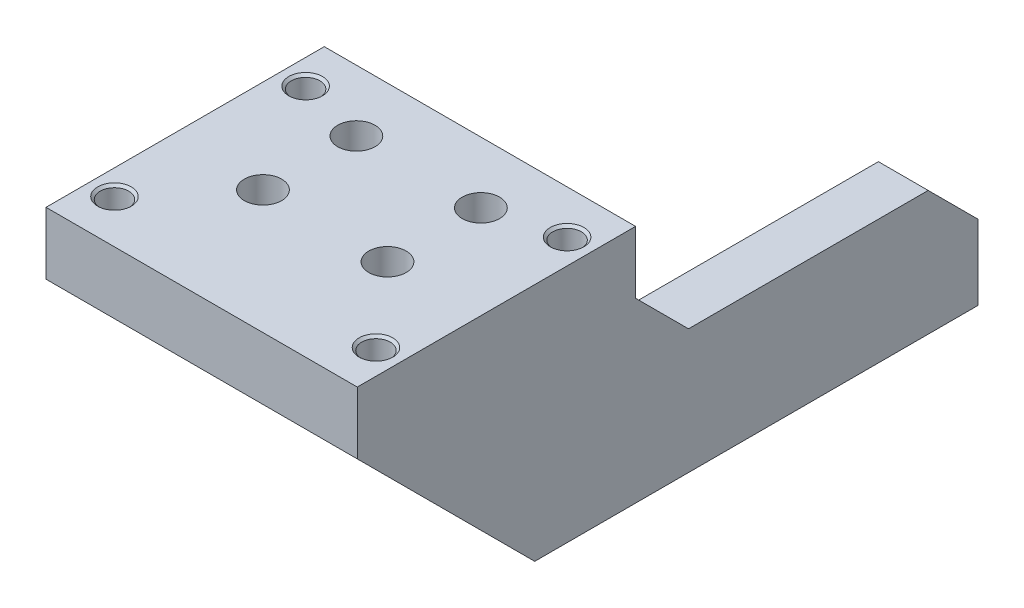
ISO-10303-21;
HEADER;
FILE_DESCRIPTION(('STEP AP214'),'2;1');
FILE_NAME('part.step','',(''),(''),'','','');
FILE_SCHEMA(('AUTOMOTIVE_DESIGN { 1 0 10303 214 1 1 1 1 }'));
ENDSEC;
DATA;
#1=APPLICATION_CONTEXT('core data for automotive mechanical design processes');
#2=APPLICATION_PROTOCOL_DEFINITION('international standard','automotive_design',2000,#1);
#3=PRODUCT_CONTEXT('',#1,'mechanical');
#4=PRODUCT('Part','Part','',(#3));
#5=PRODUCT_RELATED_PRODUCT_CATEGORY('part','',(#4));
#6=PRODUCT_DEFINITION_FORMATION('','',#4);
#7=PRODUCT_DEFINITION_CONTEXT('part definition',#1,'design');
#8=PRODUCT_DEFINITION('design','',#6,#7);
#9=PRODUCT_DEFINITION_SHAPE('','',#8);
#10=(LENGTH_UNIT() NAMED_UNIT(*) SI_UNIT(.MILLI.,.METRE.));
#11=(NAMED_UNIT(*) PLANE_ANGLE_UNIT() SI_UNIT($,.RADIAN.));
#12=(NAMED_UNIT(*) SI_UNIT($,.STERADIAN.) SOLID_ANGLE_UNIT());
#13=UNCERTAINTY_MEASURE_WITH_UNIT(LENGTH_MEASURE(1.E-05),#10,'distance_accuracy_value','');
#14=(GEOMETRIC_REPRESENTATION_CONTEXT(3) GLOBAL_UNCERTAINTY_ASSIGNED_CONTEXT((#13)) GLOBAL_UNIT_ASSIGNED_CONTEXT((#10,
#11,#12)) REPRESENTATION_CONTEXT('',''));
#15=CARTESIAN_POINT('',(0.,0.,0.));
#16=DIRECTION('',(0.,0.,1.));
#17=DIRECTION('',(1.,0.,0.));
#18=AXIS2_PLACEMENT_3D('',#15,#16,#17);
#19=CARTESIAN_POINT('',(0.,0.,0.));
#20=DIRECTION('',(0.,-1.,0.));
#21=DIRECTION('',(0.,0.,-1.));
#22=AXIS2_PLACEMENT_3D('',#19,#20,#21);
#23=PLANE('',#22);
#24=CARTESIAN_POINT('',(-10.,0.,7.5));
#25=DIRECTION('',(0.,-1.,0.));
#26=DIRECTION('',(0.,0.,-1.));
#27=AXIS2_PLACEMENT_3D('',#24,#25,#26);
#28=CIRCLE('',#27,1.75);
#29=CARTESIAN_POINT('',(-10.,0.,5.75));
#30=VERTEX_POINT('',#29);
#31=EDGE_CURVE('E212',#30,#30,#28,.F.);
#32=ORIENTED_EDGE('',*,*,#31,.T.);
#33=EDGE_LOOP('',(#32));
#34=FACE_BOUND('',#33,.T.);
#35=CARTESIAN_POINT('',(10.,0.,7.5));
#36=DIRECTION('',(0.,-1.,0.));
#37=DIRECTION('',(0.,0.,-1.));
#38=AXIS2_PLACEMENT_3D('',#35,#36,#37);
#39=CIRCLE('',#38,1.75);
#40=CARTESIAN_POINT('',(10.,0.,5.75));
#41=VERTEX_POINT('',#40);
#42=EDGE_CURVE('E209',#41,#41,#39,.F.);
#43=ORIENTED_EDGE('',*,*,#42,.T.);
#44=EDGE_LOOP('',(#43));
#45=FACE_BOUND('',#44,.T.);
#46=CARTESIAN_POINT('',(10.,0.,-7.5));
#47=DIRECTION('',(0.,-1.,0.));
#48=DIRECTION('',(0.,0.,-1.));
#49=AXIS2_PLACEMENT_3D('',#46,#47,#48);
#50=CIRCLE('',#49,1.75);
#51=CARTESIAN_POINT('',(10.,0.,-9.25));
#52=VERTEX_POINT('',#51);
#53=EDGE_CURVE('E205',#52,#52,#50,.F.);
#54=ORIENTED_EDGE('',*,*,#53,.T.);
#55=EDGE_LOOP('',(#54));
#56=FACE_BOUND('',#55,.T.);
#57=CARTESIAN_POINT('',(-10.,0.,-7.5));
#58=DIRECTION('',(0.,-1.,0.));
#59=DIRECTION('',(0.,0.,-1.));
#60=AXIS2_PLACEMENT_3D('',#57,#58,#59);
#61=CIRCLE('',#60,1.75);
#62=CARTESIAN_POINT('',(-10.,0.,-9.25));
#63=VERTEX_POINT('',#62);
#64=EDGE_CURVE('E208',#63,#63,#61,.F.);
#65=ORIENTED_EDGE('',*,*,#64,.T.);
#66=EDGE_LOOP('',(#65));
#67=FACE_BOUND('',#66,.T.);
#68=DIRECTION('',(-1.,0.,0.));
#69=VECTOR('',#68,1.);
#70=CARTESIAN_POINT('',(-25.,0.,-17.35));
#71=LINE('',#70,#69);
#72=CARTESIAN_POINT('',(17.,0.,-17.35));
#73=VERTEX_POINT('',#72);
#74=CARTESIAN_POINT('',(-25.,0.,-17.35));
#75=VERTEX_POINT('',#74);
#76=EDGE_CURVE('E218',#73,#75,#71,.T.);
#77=ORIENTED_EDGE('',*,*,#76,.F.);
#78=DIRECTION('',(0.,0.,1.));
#79=VECTOR('',#78,1.);
#80=CARTESIAN_POINT('',(17.,0.,27.35));
#81=LINE('',#80,#79);
#82=CARTESIAN_POINT('',(17.,0.,27.35));
#83=VERTEX_POINT('',#82);
#84=EDGE_CURVE('E129',#73,#83,#81,.T.);
#85=ORIENTED_EDGE('',*,*,#84,.T.);
#86=DIRECTION('',(-1.,0.,0.));
#87=VECTOR('',#86,1.);
#88=CARTESIAN_POINT('',(-25.,0.,27.35));
#89=LINE('',#88,#87);
#90=CARTESIAN_POINT('',(-25.,0.,27.35));
#91=VERTEX_POINT('',#90);
#92=EDGE_CURVE('E168',#83,#91,#89,.T.);
#93=ORIENTED_EDGE('',*,*,#92,.T.);
#94=DIRECTION('',(0.,0.,1.));
#95=VECTOR('',#94,1.);
#96=CARTESIAN_POINT('',(-25.,0.,17.35));
#97=LINE('',#96,#95);
#98=EDGE_CURVE('E223',#75,#91,#97,.T.);
#99=ORIENTED_EDGE('',*,*,#98,.F.);
#100=EDGE_LOOP('',(#77,#85,#93,#99));
#101=FACE_BOUND('',#100,.T.);
#102=ADVANCED_FACE('F41',(#34,#45,#56,#67,#101),#23,.T.);
#103=CARTESIAN_POINT('',(-10.,-0.000999999999999265,-7.5));
#104=DIRECTION('',(0.,1.,0.));
#105=DIRECTION('',(0.,0.,1.));
#106=AXIS2_PLACEMENT_3D('',#103,#104,#105);
#107=CYLINDRICAL_SURFACE('',#106,1.75);
#108=ORIENTED_EDGE('',*,*,#64,.F.);
#109=EDGE_LOOP('',(#108));
#110=FACE_BOUND('',#109,.T.);
#111=CARTESIAN_POINT('',(-10.,5.,-7.5));
#112=DIRECTION('',(0.,1.,0.));
#113=DIRECTION('',(0.,0.,1.));
#114=AXIS2_PLACEMENT_3D('',#111,#112,#113);
#115=CIRCLE('',#114,1.75);
#116=CARTESIAN_POINT('',(-10.,5.,-5.75));
#117=VERTEX_POINT('',#116);
#118=EDGE_CURVE('E215',#117,#117,#115,.F.);
#119=ORIENTED_EDGE('',*,*,#118,.F.);
#120=EDGE_LOOP('',(#119));
#121=FACE_BOUND('',#120,.T.);
#122=ADVANCED_FACE('F293',(#110,#121),#107,.F.);
#123=CARTESIAN_POINT('',(10.,-0.000999999999999265,-7.5));
#124=DIRECTION('',(0.,1.,0.));
#125=DIRECTION('',(0.,0.,1.));
#126=AXIS2_PLACEMENT_3D('',#123,#124,#125);
#127=CYLINDRICAL_SURFACE('',#126,1.75);
#128=ORIENTED_EDGE('',*,*,#53,.F.);
#129=EDGE_LOOP('',(#128));
#130=FACE_BOUND('',#129,.T.);
#131=CARTESIAN_POINT('',(10.,5.,-7.5));
#132=DIRECTION('',(0.,1.,0.));
#133=DIRECTION('',(0.,0.,1.));
#134=AXIS2_PLACEMENT_3D('',#131,#132,#133);
#135=CIRCLE('',#134,1.75);
#136=CARTESIAN_POINT('',(10.,5.,-5.75));
#137=VERTEX_POINT('',#136);
#138=EDGE_CURVE('E244',#137,#137,#135,.F.);
#139=ORIENTED_EDGE('',*,*,#138,.F.);
#140=EDGE_LOOP('',(#139));
#141=FACE_BOUND('',#140,.T.);
#142=ADVANCED_FACE('F301',(#130,#141),#127,.F.);
#143=CARTESIAN_POINT('',(10.,-0.000999999999999265,7.5));
#144=DIRECTION('',(0.,1.,0.));
#145=DIRECTION('',(0.,0.,1.));
#146=AXIS2_PLACEMENT_3D('',#143,#144,#145);
#147=CYLINDRICAL_SURFACE('',#146,1.75);
#148=ORIENTED_EDGE('',*,*,#42,.F.);
#149=EDGE_LOOP('',(#148));
#150=FACE_BOUND('',#149,.T.);
#151=CARTESIAN_POINT('',(10.,5.,7.5));
#152=DIRECTION('',(0.,1.,0.));
#153=DIRECTION('',(0.,0.,1.));
#154=AXIS2_PLACEMENT_3D('',#151,#152,#153);
#155=CIRCLE('',#154,1.75);
#156=CARTESIAN_POINT('',(10.,5.,9.25));
#157=VERTEX_POINT('',#156);
#158=EDGE_CURVE('E241',#157,#157,#155,.F.);
#159=ORIENTED_EDGE('',*,*,#158,.F.);
#160=EDGE_LOOP('',(#159));
#161=FACE_BOUND('',#160,.T.);
#162=ADVANCED_FACE('F444',(#150,#161),#147,.F.);
#163=CARTESIAN_POINT('',(-10.,-0.000999999999999265,7.5));
#164=DIRECTION('',(0.,1.,0.));
#165=DIRECTION('',(0.,0.,1.));
#166=AXIS2_PLACEMENT_3D('',#163,#164,#165);
#167=CYLINDRICAL_SURFACE('',#166,1.75);
#168=ORIENTED_EDGE('',*,*,#31,.F.);
#169=EDGE_LOOP('',(#168));
#170=FACE_BOUND('',#169,.T.);
#171=CARTESIAN_POINT('',(-10.,5.,7.5));
#172=DIRECTION('',(0.,1.,0.));
#173=DIRECTION('',(0.,0.,1.));
#174=AXIS2_PLACEMENT_3D('',#171,#172,#173);
#175=CIRCLE('',#174,1.75);
#176=CARTESIAN_POINT('',(-10.,5.,9.25));
#177=VERTEX_POINT('',#176);
#178=EDGE_CURVE('E202',#177,#177,#175,.F.);
#179=ORIENTED_EDGE('',*,*,#178,.F.);
#180=EDGE_LOOP('',(#179));
#181=FACE_BOUND('',#180,.T.);
#182=ADVANCED_FACE('F317',(#170,#181),#167,.F.);
#183=CARTESIAN_POINT('',(25.,10.,17.35));
#184=DIRECTION('',(-1.,0.,0.));
#185=DIRECTION('',(0.,0.,1.));
#186=AXIS2_PLACEMENT_3D('',#183,#184,#185);
#187=PLANE('',#186);
#188=DIRECTION('',(0.,1.,0.));
#189=VECTOR('',#188,1.);
#190=CARTESIAN_POINT('',(25.,-8.5,-72.35));
#191=LINE('',#190,#189);
#192=CARTESIAN_POINT('',(25.,-28.5,-72.35));
#193=VERTEX_POINT('',#192);
#194=CARTESIAN_POINT('',(25.,-16.5,-72.35));
#195=VERTEX_POINT('',#194);
#196=EDGE_CURVE('E162',#193,#195,#191,.T.);
#197=ORIENTED_EDGE('',*,*,#196,.T.);
#198=DIRECTION('',(0.,-0.707106781186546,-0.707106781186549));
#199=VECTOR('',#198,1.);
#200=CARTESIAN_POINT('',(25.,-16.5,-72.35));
#201=LINE('',#200,#199);
#202=CARTESIAN_POINT('',(25.,-8.5,-64.35));
#203=VERTEX_POINT('',#202);
#204=EDGE_CURVE('E65',#195,#203,#201,.F.);
#205=ORIENTED_EDGE('',*,*,#204,.T.);
#206=DIRECTION('',(0.,0.,1.));
#207=VECTOR('',#206,1.);
#208=CARTESIAN_POINT('',(25.,-8.5,-25.85));
#209=LINE('',#208,#207);
#210=CARTESIAN_POINT('',(25.,-8.5,-25.85));
#211=VERTEX_POINT('',#210);
#212=EDGE_CURVE('E147',#203,#211,#209,.T.);
#213=ORIENTED_EDGE('',*,*,#212,.T.);
#214=DIRECTION('',(0.,0.707106781186549,0.707106781186547));
#215=VECTOR('',#214,1.);
#216=CARTESIAN_POINT('',(25.,0.,-17.35));
#217=LINE('',#216,#215);
#218=CARTESIAN_POINT('',(25.,0.,-17.35));
#219=VERTEX_POINT('',#218);
#220=EDGE_CURVE('E144',#211,#219,#217,.T.);
#221=ORIENTED_EDGE('',*,*,#220,.T.);
#222=DIRECTION('',(0.,-1.,0.));
#223=VECTOR('',#222,1.);
#224=CARTESIAN_POINT('',(25.,10.,-17.35));
#225=LINE('',#224,#223);
#226=CARTESIAN_POINT('',(25.,10.,-17.35));
#227=VERTEX_POINT('',#226);
#228=EDGE_CURVE('E235',#227,#219,#225,.T.);
#229=ORIENTED_EDGE('',*,*,#228,.F.);
#230=DIRECTION('',(0.,0.,-1.));
#231=VECTOR('',#230,1.);
#232=CARTESIAN_POINT('',(25.,10.,17.35));
#233=LINE('',#232,#231);
#234=CARTESIAN_POINT('',(25.,10.,27.35));
#235=VERTEX_POINT('',#234);
#236=EDGE_CURVE('E219',#235,#227,#233,.T.);
#237=ORIENTED_EDGE('',*,*,#236,.F.);
#238=DIRECTION('',(0.,-1.,0.));
#239=VECTOR('',#238,1.);
#240=CARTESIAN_POINT('',(25.,60.9901951359279,27.35));
#241=LINE('',#240,#239);
#242=CARTESIAN_POINT('',(25.,0.,27.35));
#243=VERTEX_POINT('',#242);
#244=EDGE_CURVE('E176',#235,#243,#241,.T.);
#245=ORIENTED_EDGE('',*,*,#244,.T.);
#246=DIRECTION('',(0.,-0.707106781186549,-0.707106781186546));
#247=VECTOR('',#246,1.);
#248=CARTESIAN_POINT('',(25.,-28.5,-1.14999999999991));
#249=LINE('',#248,#247);
#250=CARTESIAN_POINT('',(25.,-28.5,-1.14999999999991));
#251=VERTEX_POINT('',#250);
#252=EDGE_CURVE('E159',#243,#251,#249,.T.);
#253=ORIENTED_EDGE('',*,*,#252,.T.);
#254=DIRECTION('',(0.,0.,-1.));
#255=VECTOR('',#254,1.);
#256=CARTESIAN_POINT('',(25.,-28.5,-72.35));
#257=LINE('',#256,#255);
#258=EDGE_CURVE('E124',#251,#193,#257,.T.);
#259=ORIENTED_EDGE('',*,*,#258,.T.);
#260=EDGE_LOOP('',(#197,#205,#213,#221,#229,#237,#245,#253,#259));
#261=FACE_BOUND('',#260,.T.);
#262=ADVANCED_FACE('F313',(#261),#187,.F.);
#263=CARTESIAN_POINT('',(-25.,10.,-17.35));
#264=DIRECTION('',(0.,0.,1.));
#265=DIRECTION('',(1.,0.,0.));
#266=AXIS2_PLACEMENT_3D('',#263,#264,#265);
#267=PLANE('',#266);
#268=EDGE_CURVE('E228',#219,#73,#71,.T.);
#269=ORIENTED_EDGE('',*,*,#268,.T.);
#270=ORIENTED_EDGE('',*,*,#76,.T.);
#271=DIRECTION('',(0.,-1.,0.));
#272=VECTOR('',#271,1.);
#273=CARTESIAN_POINT('',(-25.,10.,-17.35));
#274=LINE('',#273,#272);
#275=CARTESIAN_POINT('',(-25.,10.,-17.35));
#276=VERTEX_POINT('',#275);
#277=EDGE_CURVE('E227',#276,#75,#274,.T.);
#278=ORIENTED_EDGE('',*,*,#277,.F.);
#279=DIRECTION('',(-1.,0.,0.));
#280=VECTOR('',#279,1.);
#281=CARTESIAN_POINT('',(-25.,10.,-17.35));
#282=LINE('',#281,#280);
#283=EDGE_CURVE('E222',#227,#276,#282,.T.);
#284=ORIENTED_EDGE('',*,*,#283,.F.);
#285=ORIENTED_EDGE('',*,*,#228,.T.);
#286=EDGE_LOOP('',(#269,#270,#278,#284,#285));
#287=FACE_BOUND('',#286,.T.);
#288=ADVANCED_FACE('F310',(#287),#267,.F.);
#289=CARTESIAN_POINT('',(-25.,10.,17.35));
#290=DIRECTION('',(1.,0.,0.));
#291=DIRECTION('',(0.,0.,-1.));
#292=AXIS2_PLACEMENT_3D('',#289,#290,#291);
#293=PLANE('',#292);
#294=ORIENTED_EDGE('',*,*,#98,.T.);
#295=DIRECTION('',(0.,-1.,0.));
#296=VECTOR('',#295,1.);
#297=CARTESIAN_POINT('',(-25.,60.9901951359279,27.35));
#298=LINE('',#297,#296);
#299=CARTESIAN_POINT('',(-25.,10.,27.35));
#300=VERTEX_POINT('',#299);
#301=EDGE_CURVE('E174',#300,#91,#298,.T.);
#302=ORIENTED_EDGE('',*,*,#301,.F.);
#303=DIRECTION('',(0.,0.,1.));
#304=VECTOR('',#303,1.);
#305=CARTESIAN_POINT('',(-25.,10.,17.35));
#306=LINE('',#305,#304);
#307=EDGE_CURVE('E225',#276,#300,#306,.T.);
#308=ORIENTED_EDGE('',*,*,#307,.F.);
#309=ORIENTED_EDGE('',*,*,#277,.T.);
#310=EDGE_LOOP('',(#294,#302,#308,#309));
#311=FACE_BOUND('',#310,.T.);
#312=ADVANCED_FACE('F308',(#311),#293,.F.);
#313=CARTESIAN_POINT('',(0.,10.,0.));
#314=DIRECTION('',(0.,-1.,0.));
#315=DIRECTION('',(0.,0.,-1.));
#316=AXIS2_PLACEMENT_3D('',#313,#314,#315);
#317=PLANE('',#316);
#318=CARTESIAN_POINT('',(21.,10.,-10.35));
#319=DIRECTION('',(0.,-1.,0.));
#320=DIRECTION('',(0.,0.,-1.));
#321=AXIS2_PLACEMENT_3D('',#318,#319,#320);
#322=CIRCLE('',#321,2.69999999999999);
#323=CARTESIAN_POINT('',(21.,10.,-13.05));
#324=VERTEX_POINT('',#323);
#325=EDGE_CURVE('E267',#324,#324,#322,.T.);
#326=ORIENTED_EDGE('',*,*,#325,.T.);
#327=EDGE_LOOP('',(#326));
#328=FACE_BOUND('',#327,.T.);
#329=CARTESIAN_POINT('',(-21.,10.,-10.35));
#330=DIRECTION('',(0.,-1.,0.));
#331=DIRECTION('',(0.,0.,-1.));
#332=AXIS2_PLACEMENT_3D('',#329,#330,#331);
#333=CIRCLE('',#332,2.70000000000001);
#334=CARTESIAN_POINT('',(-21.,10.,-7.65));
#335=VERTEX_POINT('',#334);
#336=EDGE_CURVE('E264',#335,#335,#333,.T.);
#337=ORIENTED_EDGE('',*,*,#336,.T.);
#338=EDGE_LOOP('',(#337));
#339=FACE_BOUND('',#338,.T.);
#340=CARTESIAN_POINT('',(-21.,10.,20.35));
#341=DIRECTION('',(0.,-1.,0.));
#342=DIRECTION('',(0.,0.,-1.));
#343=AXIS2_PLACEMENT_3D('',#340,#341,#342);
#344=CIRCLE('',#343,2.69999999999999);
#345=CARTESIAN_POINT('',(-21.,10.,17.65));
#346=VERTEX_POINT('',#345);
#347=EDGE_CURVE('E261',#346,#346,#344,.T.);
#348=ORIENTED_EDGE('',*,*,#347,.T.);
#349=EDGE_LOOP('',(#348));
#350=FACE_BOUND('',#349,.T.);
#351=CARTESIAN_POINT('',(21.,10.,20.35));
#352=DIRECTION('',(0.,-1.,0.));
#353=DIRECTION('',(0.,0.,-1.));
#354=AXIS2_PLACEMENT_3D('',#351,#352,#353);
#355=CIRCLE('',#354,2.70000000000001);
#356=CARTESIAN_POINT('',(21.,10.,17.65));
#357=VERTEX_POINT('',#356);
#358=EDGE_CURVE('E258',#357,#357,#355,.T.);
#359=ORIENTED_EDGE('',*,*,#358,.T.);
#360=EDGE_LOOP('',(#359));
#361=FACE_BOUND('',#360,.T.);
#362=CARTESIAN_POINT('',(-10.,10.,-7.5));
#363=DIRECTION('',(0.,1.,0.));
#364=DIRECTION('',(0.,0.,1.));
#365=AXIS2_PLACEMENT_3D('',#362,#363,#364);
#366=CIRCLE('',#365,3.);
#367=CARTESIAN_POINT('',(-10.,10.,-4.5));
#368=VERTEX_POINT('',#367);
#369=EDGE_CURVE('E187',#368,#368,#366,.T.);
#370=ORIENTED_EDGE('',*,*,#369,.F.);
#371=EDGE_LOOP('',(#370));
#372=FACE_BOUND('',#371,.T.);
#373=CARTESIAN_POINT('',(10.,10.,7.5));
#374=DIRECTION('',(0.,1.,0.));
#375=DIRECTION('',(0.,0.,1.));
#376=AXIS2_PLACEMENT_3D('',#373,#374,#375);
#377=CIRCLE('',#376,3.);
#378=CARTESIAN_POINT('',(10.,10.,10.5));
#379=VERTEX_POINT('',#378);
#380=EDGE_CURVE('E194',#379,#379,#377,.T.);
#381=ORIENTED_EDGE('',*,*,#380,.F.);
#382=EDGE_LOOP('',(#381));
#383=FACE_BOUND('',#382,.T.);
#384=CARTESIAN_POINT('',(-10.,10.,7.5));
#385=DIRECTION('',(0.,1.,0.));
#386=DIRECTION('',(0.,0.,1.));
#387=AXIS2_PLACEMENT_3D('',#384,#385,#386);
#388=CIRCLE('',#387,3.);
#389=CARTESIAN_POINT('',(-10.,10.,10.5));
#390=VERTEX_POINT('',#389);
#391=EDGE_CURVE('E181',#390,#390,#388,.T.);
#392=ORIENTED_EDGE('',*,*,#391,.F.);
#393=EDGE_LOOP('',(#392));
#394=FACE_BOUND('',#393,.T.);
#395=CARTESIAN_POINT('',(10.,10.,-7.5));
#396=DIRECTION('',(0.,1.,0.));
#397=DIRECTION('',(0.,0.,1.));
#398=AXIS2_PLACEMENT_3D('',#395,#396,#397);
#399=CIRCLE('',#398,3.);
#400=CARTESIAN_POINT('',(10.,10.,-4.5));
#401=VERTEX_POINT('',#400);
#402=EDGE_CURVE('E190',#401,#401,#399,.T.);
#403=ORIENTED_EDGE('',*,*,#402,.F.);
#404=EDGE_LOOP('',(#403));
#405=FACE_BOUND('',#404,.T.);
#406=ORIENTED_EDGE('',*,*,#236,.T.);
#407=ORIENTED_EDGE('',*,*,#283,.T.);
#408=ORIENTED_EDGE('',*,*,#307,.T.);
#409=DIRECTION('',(1.,0.,0.));
#410=VECTOR('',#409,1.);
#411=CARTESIAN_POINT('',(-25.,10.,27.35));
#412=LINE('',#411,#410);
#413=EDGE_CURVE('E170',#300,#235,#412,.T.);
#414=ORIENTED_EDGE('',*,*,#413,.T.);
#415=EDGE_LOOP('',(#406,#407,#408,#414));
#416=FACE_BOUND('',#415,.T.);
#417=ADVANCED_FACE('F307',(#328,#339,#350,#361,#372,#383,#394,#405,#416),#317,.F.);
#418=CARTESIAN_POINT('',(-10.,5.,7.5));
#419=DIRECTION('',(0.,1.,0.));
#420=DIRECTION('',(0.,0.,1.));
#421=AXIS2_PLACEMENT_3D('',#418,#419,#420);
#422=PLANE('',#421);
#423=CARTESIAN_POINT('',(-10.,5.,7.5));
#424=DIRECTION('',(0.,1.,0.));
#425=DIRECTION('',(0.,0.,1.));
#426=AXIS2_PLACEMENT_3D('',#423,#424,#425);
#427=CIRCLE('',#426,3.);
#428=CARTESIAN_POINT('',(-10.,5.,10.5));
#429=VERTEX_POINT('',#428);
#430=EDGE_CURVE('E173',#429,#429,#427,.T.);
#431=ORIENTED_EDGE('',*,*,#430,.T.);
#432=EDGE_LOOP('',(#431));
#433=FACE_BOUND('',#432,.T.);
#434=ORIENTED_EDGE('',*,*,#178,.T.);
#435=EDGE_LOOP('',(#434));
#436=FACE_BOUND('',#435,.T.);
#437=ADVANCED_FACE('F415',(#433,#436),#422,.T.);
#438=CARTESIAN_POINT('',(-10.,5.,7.5));
#439=DIRECTION('',(0.,1.,0.));
#440=DIRECTION('',(0.,0.,1.));
#441=AXIS2_PLACEMENT_3D('',#438,#439,#440);
#442=CYLINDRICAL_SURFACE('',#441,3.);
#443=ORIENTED_EDGE('',*,*,#430,.F.);
#444=EDGE_LOOP('',(#443));
#445=FACE_BOUND('',#444,.T.);
#446=ORIENTED_EDGE('',*,*,#391,.T.);
#447=EDGE_LOOP('',(#446));
#448=FACE_BOUND('',#447,.T.);
#449=ADVANCED_FACE('F411',(#445,#448),#442,.F.);
#450=CARTESIAN_POINT('',(10.,5.,7.5));
#451=DIRECTION('',(0.,1.,0.));
#452=DIRECTION('',(0.,0.,1.));
#453=AXIS2_PLACEMENT_3D('',#450,#451,#452);
#454=PLANE('',#453);
#455=CARTESIAN_POINT('',(10.,5.,7.5));
#456=DIRECTION('',(0.,1.,0.));
#457=DIRECTION('',(0.,0.,1.));
#458=AXIS2_PLACEMENT_3D('',#455,#456,#457);
#459=CIRCLE('',#458,3.);
#460=CARTESIAN_POINT('',(10.,5.,10.5));
#461=VERTEX_POINT('',#460);
#462=EDGE_CURVE('E184',#461,#461,#459,.T.);
#463=ORIENTED_EDGE('',*,*,#462,.T.);
#464=EDGE_LOOP('',(#463));
#465=FACE_BOUND('',#464,.T.);
#466=ORIENTED_EDGE('',*,*,#158,.T.);
#467=EDGE_LOOP('',(#466));
#468=FACE_BOUND('',#467,.T.);
#469=ADVANCED_FACE('F414',(#465,#468),#454,.T.);
#470=CARTESIAN_POINT('',(10.,5.,7.5));
#471=DIRECTION('',(0.,1.,0.));
#472=DIRECTION('',(0.,0.,1.));
#473=AXIS2_PLACEMENT_3D('',#470,#471,#472);
#474=CYLINDRICAL_SURFACE('',#473,3.);
#475=ORIENTED_EDGE('',*,*,#462,.F.);
#476=EDGE_LOOP('',(#475));
#477=FACE_BOUND('',#476,.T.);
#478=ORIENTED_EDGE('',*,*,#380,.T.);
#479=EDGE_LOOP('',(#478));
#480=FACE_BOUND('',#479,.T.);
#481=ADVANCED_FACE('F428',(#477,#480),#474,.F.);
#482=CARTESIAN_POINT('',(10.,5.,-7.5));
#483=DIRECTION('',(0.,1.,0.));
#484=DIRECTION('',(0.,0.,1.));
#485=AXIS2_PLACEMENT_3D('',#482,#483,#484);
#486=PLANE('',#485);
#487=CARTESIAN_POINT('',(10.,5.,-7.5));
#488=DIRECTION('',(0.,1.,0.));
#489=DIRECTION('',(0.,0.,1.));
#490=AXIS2_PLACEMENT_3D('',#487,#488,#489);
#491=CIRCLE('',#490,3.);
#492=CARTESIAN_POINT('',(10.,5.,-4.5));
#493=VERTEX_POINT('',#492);
#494=EDGE_CURVE('E199',#493,#493,#491,.T.);
#495=ORIENTED_EDGE('',*,*,#494,.T.);
#496=EDGE_LOOP('',(#495));
#497=FACE_BOUND('',#496,.T.);
#498=ORIENTED_EDGE('',*,*,#138,.T.);
#499=EDGE_LOOP('',(#498));
#500=FACE_BOUND('',#499,.T.);
#501=ADVANCED_FACE('F431',(#497,#500),#486,.T.);
#502=CARTESIAN_POINT('',(10.,5.,-7.5));
#503=DIRECTION('',(0.,1.,0.));
#504=DIRECTION('',(0.,0.,1.));
#505=AXIS2_PLACEMENT_3D('',#502,#503,#504);
#506=CYLINDRICAL_SURFACE('',#505,3.);
#507=ORIENTED_EDGE('',*,*,#494,.F.);
#508=EDGE_LOOP('',(#507));
#509=FACE_BOUND('',#508,.T.);
#510=ORIENTED_EDGE('',*,*,#402,.T.);
#511=EDGE_LOOP('',(#510));
#512=FACE_BOUND('',#511,.T.);
#513=ADVANCED_FACE('F426',(#509,#512),#506,.F.);
#514=CARTESIAN_POINT('',(-10.,5.,-7.5));
#515=DIRECTION('',(0.,1.,0.));
#516=DIRECTION('',(0.,0.,1.));
#517=AXIS2_PLACEMENT_3D('',#514,#515,#516);
#518=PLANE('',#517);
#519=CARTESIAN_POINT('',(-10.,5.,-7.5));
#520=DIRECTION('',(0.,1.,0.));
#521=DIRECTION('',(0.,0.,1.));
#522=AXIS2_PLACEMENT_3D('',#519,#520,#521);
#523=CIRCLE('',#522,3.);
#524=CARTESIAN_POINT('',(-10.,5.,-4.5));
#525=VERTEX_POINT('',#524);
#526=EDGE_CURVE('E191',#525,#525,#523,.T.);
#527=ORIENTED_EDGE('',*,*,#526,.T.);
#528=EDGE_LOOP('',(#527));
#529=FACE_BOUND('',#528,.T.);
#530=ORIENTED_EDGE('',*,*,#118,.T.);
#531=EDGE_LOOP('',(#530));
#532=FACE_BOUND('',#531,.T.);
#533=ADVANCED_FACE('F422',(#529,#532),#518,.T.);
#534=CARTESIAN_POINT('',(-10.,5.,-7.5));
#535=DIRECTION('',(0.,1.,0.));
#536=DIRECTION('',(0.,0.,1.));
#537=AXIS2_PLACEMENT_3D('',#534,#535,#536);
#538=CYLINDRICAL_SURFACE('',#537,3.);
#539=ORIENTED_EDGE('',*,*,#526,.F.);
#540=EDGE_LOOP('',(#539));
#541=FACE_BOUND('',#540,.T.);
#542=ORIENTED_EDGE('',*,*,#369,.T.);
#543=EDGE_LOOP('',(#542));
#544=FACE_BOUND('',#543,.T.);
#545=ADVANCED_FACE('F409',(#541,#544),#538,.F.);
#546=CARTESIAN_POINT('',(-25.,60.9901951359279,27.35));
#547=DIRECTION('',(0.,0.,1.));
#548=DIRECTION('',(1.,0.,0.));
#549=AXIS2_PLACEMENT_3D('',#546,#547,#548);
#550=PLANE('',#549);
#551=ORIENTED_EDGE('',*,*,#413,.F.);
#552=ORIENTED_EDGE('',*,*,#301,.T.);
#553=ORIENTED_EDGE('',*,*,#92,.F.);
#554=EDGE_CURVE('E142',#243,#83,#89,.T.);
#555=ORIENTED_EDGE('',*,*,#554,.F.);
#556=ORIENTED_EDGE('',*,*,#244,.F.);
#557=EDGE_LOOP('',(#551,#552,#553,#555,#556));
#558=FACE_BOUND('',#557,.T.);
#559=ADVANCED_FACE('F406',(#558),#550,.T.);
#560=CARTESIAN_POINT('',(17.,-28.5,-1.14999999999991));
#561=DIRECTION('',(0.,-0.707106781186546,0.707106781186549));
#562=DIRECTION('',(0.,-0.707106781186549,-0.707106781186546));
#563=AXIS2_PLACEMENT_3D('',#560,#561,#562);
#564=PLANE('',#563);
#565=ORIENTED_EDGE('',*,*,#252,.F.);
#566=ORIENTED_EDGE('',*,*,#554,.T.);
#567=DIRECTION('',(0.,-0.707106781186549,-0.707106781186546));
#568=VECTOR('',#567,1.);
#569=CARTESIAN_POINT('',(17.,-28.5,-1.14999999999991));
#570=LINE('',#569,#568);
#571=CARTESIAN_POINT('',(17.,-28.5,-1.14999999999991));
#572=VERTEX_POINT('',#571);
#573=EDGE_CURVE('E135',#83,#572,#570,.T.);
#574=ORIENTED_EDGE('',*,*,#573,.T.);
#575=DIRECTION('',(1.,0.,0.));
#576=VECTOR('',#575,1.);
#577=CARTESIAN_POINT('',(17.,-28.5,-1.14999999999991));
#578=LINE('',#577,#576);
#579=EDGE_CURVE('E119',#572,#251,#578,.T.);
#580=ORIENTED_EDGE('',*,*,#579,.T.);
#581=EDGE_LOOP('',(#565,#566,#574,#580));
#582=FACE_BOUND('',#581,.T.);
#583=ADVANCED_FACE('F140',(#582),#564,.T.);
#584=CARTESIAN_POINT('',(17.,0.,-17.35));
#585=DIRECTION('',(0.,0.707106781186547,-0.707106781186549));
#586=DIRECTION('',(0.,0.707106781186549,0.707106781186547));
#587=AXIS2_PLACEMENT_3D('',#584,#585,#586);
#588=PLANE('',#587);
#589=ORIENTED_EDGE('',*,*,#220,.F.);
#590=DIRECTION('',(1.,0.,0.));
#591=VECTOR('',#590,1.);
#592=CARTESIAN_POINT('',(17.,-8.5,-25.85));
#593=LINE('',#592,#591);
#594=CARTESIAN_POINT('',(17.,-8.5,-25.85));
#595=VERTEX_POINT('',#594);
#596=EDGE_CURVE('E165',#595,#211,#593,.T.);
#597=ORIENTED_EDGE('',*,*,#596,.F.);
#598=DIRECTION('',(0.,0.707106781186549,0.707106781186547));
#599=VECTOR('',#598,1.);
#600=CARTESIAN_POINT('',(17.,0.,-17.35));
#601=LINE('',#600,#599);
#602=EDGE_CURVE('E156',#595,#73,#601,.T.);
#603=ORIENTED_EDGE('',*,*,#602,.T.);
#604=ORIENTED_EDGE('',*,*,#268,.F.);
#605=EDGE_LOOP('',(#589,#597,#603,#604));
#606=FACE_BOUND('',#605,.T.);
#607=ADVANCED_FACE('F391',(#606),#588,.T.);
#608=CARTESIAN_POINT('',(17.,-8.5,-25.85));
#609=DIRECTION('',(0.,1.,0.));
#610=DIRECTION('',(0.,0.,1.));
#611=AXIS2_PLACEMENT_3D('',#608,#609,#610);
#612=PLANE('',#611);
#613=ORIENTED_EDGE('',*,*,#212,.F.);
#614=DIRECTION('',(-1.,0.,0.));
#615=VECTOR('',#614,1.);
#616=CARTESIAN_POINT('',(17.,-8.5,-64.35));
#617=LINE('',#616,#615);
#618=CARTESIAN_POINT('',(17.,-8.5,-64.35));
#619=VERTEX_POINT('',#618);
#620=EDGE_CURVE('E57',#203,#619,#617,.T.);
#621=ORIENTED_EDGE('',*,*,#620,.T.);
#622=DIRECTION('',(0.,0.,1.));
#623=VECTOR('',#622,1.);
#624=CARTESIAN_POINT('',(17.,-8.5,-25.85));
#625=LINE('',#624,#623);
#626=EDGE_CURVE('E154',#619,#595,#625,.T.);
#627=ORIENTED_EDGE('',*,*,#626,.T.);
#628=ORIENTED_EDGE('',*,*,#596,.T.);
#629=EDGE_LOOP('',(#613,#621,#627,#628));
#630=FACE_BOUND('',#629,.T.);
#631=ADVANCED_FACE('F394',(#630),#612,.T.);
#632=CARTESIAN_POINT('',(17.,-8.5,-72.35));
#633=DIRECTION('',(0.,0.,-1.));
#634=DIRECTION('',(-1.,0.,0.));
#635=AXIS2_PLACEMENT_3D('',#632,#633,#634);
#636=PLANE('',#635);
#637=DIRECTION('',(0.,1.,0.));
#638=VECTOR('',#637,1.);
#639=CARTESIAN_POINT('',(17.,-8.5,-72.35));
#640=LINE('',#639,#638);
#641=CARTESIAN_POINT('',(17.,-28.5,-72.35));
#642=VERTEX_POINT('',#641);
#643=CARTESIAN_POINT('',(17.,-16.5,-72.35));
#644=VERTEX_POINT('',#643);
#645=EDGE_CURVE('E138',#642,#644,#640,.T.);
#646=ORIENTED_EDGE('',*,*,#645,.T.);
#647=DIRECTION('',(1.,0.,0.));
#648=VECTOR('',#647,1.);
#649=CARTESIAN_POINT('',(17.,-16.5,-72.35));
#650=LINE('',#649,#648);
#651=EDGE_CURVE('E238',#644,#195,#650,.T.);
#652=ORIENTED_EDGE('',*,*,#651,.T.);
#653=ORIENTED_EDGE('',*,*,#196,.F.);
#654=DIRECTION('',(1.,0.,0.));
#655=VECTOR('',#654,1.);
#656=CARTESIAN_POINT('',(17.,-28.5,-72.35));
#657=LINE('',#656,#655);
#658=EDGE_CURVE('E128',#642,#193,#657,.T.);
#659=ORIENTED_EDGE('',*,*,#658,.F.);
#660=EDGE_LOOP('',(#646,#652,#653,#659));
#661=FACE_BOUND('',#660,.T.);
#662=ADVANCED_FACE('F398',(#661),#636,.T.);
#663=CARTESIAN_POINT('',(17.,-28.5,-72.35));
#664=DIRECTION('',(0.,-1.,0.));
#665=DIRECTION('',(0.,0.,-1.));
#666=AXIS2_PLACEMENT_3D('',#663,#664,#665);
#667=PLANE('',#666);
#668=ORIENTED_EDGE('',*,*,#258,.F.);
#669=ORIENTED_EDGE('',*,*,#579,.F.);
#670=DIRECTION('',(0.,0.,-1.));
#671=VECTOR('',#670,1.);
#672=CARTESIAN_POINT('',(17.,-28.5,-72.35));
#673=LINE('',#672,#671);
#674=EDGE_CURVE('E122',#572,#642,#673,.T.);
#675=ORIENTED_EDGE('',*,*,#674,.T.);
#676=ORIENTED_EDGE('',*,*,#658,.T.);
#677=EDGE_LOOP('',(#668,#669,#675,#676));
#678=FACE_BOUND('',#677,.T.);
#679=ADVANCED_FACE('F121',(#678),#667,.T.);
#680=CARTESIAN_POINT('',(17.,0.,0.));
#681=DIRECTION('',(-1.,0.,0.));
#682=DIRECTION('',(0.,0.,1.));
#683=AXIS2_PLACEMENT_3D('',#680,#681,#682);
#684=PLANE('',#683);
#685=ORIENTED_EDGE('',*,*,#626,.F.);
#686=DIRECTION('',(0.,0.707106781186546,0.707106781186549));
#687=VECTOR('',#686,1.);
#688=CARTESIAN_POINT('',(17.,27.925,-27.9249999999998));
#689=LINE('',#688,#687);
#690=EDGE_CURVE('E253',#619,#644,#689,.F.);
#691=ORIENTED_EDGE('',*,*,#690,.T.);
#692=ORIENTED_EDGE('',*,*,#645,.F.);
#693=ORIENTED_EDGE('',*,*,#674,.F.);
#694=ORIENTED_EDGE('',*,*,#573,.F.);
#695=ORIENTED_EDGE('',*,*,#84,.F.);
#696=ORIENTED_EDGE('',*,*,#602,.F.);
#697=EDGE_LOOP('',(#685,#691,#692,#693,#694,#695,#696));
#698=FACE_BOUND('',#697,.T.);
#699=ADVANCED_FACE('F133',(#698),#684,.T.);
#700=CARTESIAN_POINT('',(17.,-16.5,-72.35));
#701=DIRECTION('',(0.,-0.707106781186549,0.707106781186546));
#702=DIRECTION('',(1.,0.,0.));
#703=AXIS2_PLACEMENT_3D('',#700,#701,#702);
#704=PLANE('',#703);
#705=ORIENTED_EDGE('',*,*,#690,.F.);
#706=ORIENTED_EDGE('',*,*,#620,.F.);
#707=ORIENTED_EDGE('',*,*,#204,.F.);
#708=ORIENTED_EDGE('',*,*,#651,.F.);
#709=EDGE_LOOP('',(#705,#706,#707,#708));
#710=FACE_BOUND('',#709,.T.);
#711=ADVANCED_FACE('F319',(#710),#704,.F.);
#712=CARTESIAN_POINT('',(21.,5.2,-10.35));
#713=DIRECTION('',(0.,1.,0.));
#714=DIRECTION('',(0.,0.,1.));
#715=AXIS2_PLACEMENT_3D('',#712,#713,#714);
#716=CYLINDRICAL_SURFACE('',#715,2.3);
#717=CARTESIAN_POINT('',(21.,9.60000000000002,-10.35));
#718=DIRECTION('',(0.,-1.,0.));
#719=DIRECTION('',(0.,0.,-1.));
#720=AXIS2_PLACEMENT_3D('',#717,#718,#719);
#721=CIRCLE('',#720,2.3);
#722=CARTESIAN_POINT('',(21.,9.60000000000002,-12.65));
#723=VERTEX_POINT('',#722);
#724=EDGE_CURVE('E255',#723,#723,#721,.F.);
#725=ORIENTED_EDGE('',*,*,#724,.T.);
#726=EDGE_LOOP('',(#725));
#727=FACE_BOUND('',#726,.T.);
#728=CARTESIAN_POINT('',(21.,5.2,-10.35));
#729=DIRECTION('',(0.,1.,0.));
#730=DIRECTION('',(0.,0.,1.));
#731=AXIS2_PLACEMENT_3D('',#728,#729,#730);
#732=CIRCLE('',#731,2.3);
#733=CARTESIAN_POINT('',(21.,5.2,-8.05));
#734=VERTEX_POINT('',#733);
#735=EDGE_CURVE('E150',#734,#734,#732,.T.);
#736=ORIENTED_EDGE('',*,*,#735,.F.);
#737=EDGE_LOOP('',(#736));
#738=FACE_BOUND('',#737,.T.);
#739=ADVANCED_FACE('F325',(#727,#738),#716,.F.);
#740=CARTESIAN_POINT('',(21.,5.2,-10.35));
#741=DIRECTION('',(0.,1.,0.));
#742=DIRECTION('',(0.,0.,1.));
#743=AXIS2_PLACEMENT_3D('',#740,#741,#742);
#744=PLANE('',#743);
#745=ORIENTED_EDGE('',*,*,#735,.T.);
#746=EDGE_LOOP('',(#745));
#747=FACE_BOUND('',#746,.T.);
#748=ADVANCED_FACE('F351',(#747),#744,.T.);
#749=CARTESIAN_POINT('',(21.,5.2,20.35));
#750=DIRECTION('',(0.,1.,0.));
#751=DIRECTION('',(0.,0.,1.));
#752=AXIS2_PLACEMENT_3D('',#749,#750,#751);
#753=CYLINDRICAL_SURFACE('',#752,2.3);
#754=CARTESIAN_POINT('',(21.,9.59999999999998,20.35));
#755=DIRECTION('',(0.,-1.,0.));
#756=DIRECTION('',(0.,0.,-1.));
#757=AXIS2_PLACEMENT_3D('',#754,#755,#756);
#758=CIRCLE('',#757,2.3);
#759=CARTESIAN_POINT('',(21.,9.59999999999998,18.05));
#760=VERTEX_POINT('',#759);
#761=EDGE_CURVE('E11',#760,#760,#758,.F.);
#762=ORIENTED_EDGE('',*,*,#761,.T.);
#763=EDGE_LOOP('',(#762));
#764=FACE_BOUND('',#763,.T.);
#765=CARTESIAN_POINT('',(21.,5.2,20.35));
#766=DIRECTION('',(0.,-1.,0.));
#767=DIRECTION('',(0.,0.,-1.));
#768=AXIS2_PLACEMENT_3D('',#765,#766,#767);
#769=CIRCLE('',#768,2.3);
#770=CARTESIAN_POINT('',(21.,5.2,18.05));
#771=VERTEX_POINT('',#770);
#772=EDGE_CURVE('E356',#771,#771,#769,.T.);
#773=ORIENTED_EDGE('',*,*,#772,.T.);
#774=EDGE_LOOP('',(#773));
#775=FACE_BOUND('',#774,.T.);
#776=ADVANCED_FACE('F382',(#764,#775),#753,.F.);
#777=CARTESIAN_POINT('',(21.,5.2,20.35));
#778=DIRECTION('',(0.,1.,0.));
#779=DIRECTION('',(0.,0.,-1.));
#780=AXIS2_PLACEMENT_3D('',#777,#778,#779);
#781=PLANE('',#780);
#782=ORIENTED_EDGE('',*,*,#772,.F.);
#783=EDGE_LOOP('',(#782));
#784=FACE_BOUND('',#783,.T.);
#785=ADVANCED_FACE('F378',(#784),#781,.T.);
#786=CARTESIAN_POINT('',(-21.,5.2,-10.35));
#787=DIRECTION('',(0.,1.,0.));
#788=DIRECTION('',(0.,0.,1.));
#789=AXIS2_PLACEMENT_3D('',#786,#787,#788);
#790=CYLINDRICAL_SURFACE('',#789,2.3);
#791=CARTESIAN_POINT('',(-21.,9.59999999999999,-10.35));
#792=DIRECTION('',(0.,-1.,0.));
#793=DIRECTION('',(0.,0.,-1.));
#794=AXIS2_PLACEMENT_3D('',#791,#792,#793);
#795=CIRCLE('',#794,2.3);
#796=CARTESIAN_POINT('',(-21.,9.59999999999999,-8.05));
#797=VERTEX_POINT('',#796);
#798=EDGE_CURVE('E270',#797,#797,#795,.F.);
#799=ORIENTED_EDGE('',*,*,#798,.T.);
#800=EDGE_LOOP('',(#799));
#801=FACE_BOUND('',#800,.T.);
#802=CARTESIAN_POINT('',(-21.,5.2,-10.35));
#803=DIRECTION('',(0.,-1.,0.));
#804=DIRECTION('',(0.,0.,1.));
#805=AXIS2_PLACEMENT_3D('',#802,#803,#804);
#806=CIRCLE('',#805,2.3);
#807=CARTESIAN_POINT('',(-21.,5.2,-8.05));
#808=VERTEX_POINT('',#807);
#809=EDGE_CURVE('E358',#808,#808,#806,.T.);
#810=ORIENTED_EDGE('',*,*,#809,.T.);
#811=EDGE_LOOP('',(#810));
#812=FACE_BOUND('',#811,.T.);
#813=ADVANCED_FACE('F373',(#801,#812),#790,.F.);
#814=CARTESIAN_POINT('',(-21.,5.2,-10.35));
#815=DIRECTION('',(0.,1.,0.));
#816=DIRECTION('',(0.,0.,1.));
#817=AXIS2_PLACEMENT_3D('',#814,#815,#816);
#818=PLANE('',#817);
#819=ORIENTED_EDGE('',*,*,#809,.F.);
#820=EDGE_LOOP('',(#819));
#821=FACE_BOUND('',#820,.T.);
#822=ADVANCED_FACE('F367',(#821),#818,.T.);
#823=CARTESIAN_POINT('',(-21.,5.2,20.35));
#824=DIRECTION('',(0.,1.,0.));
#825=DIRECTION('',(0.,0.,1.));
#826=AXIS2_PLACEMENT_3D('',#823,#824,#825);
#827=CYLINDRICAL_SURFACE('',#826,2.3);
#828=CARTESIAN_POINT('',(-21.,9.60000000000002,20.35));
#829=DIRECTION('',(0.,-1.,0.));
#830=DIRECTION('',(0.,0.,-1.));
#831=AXIS2_PLACEMENT_3D('',#828,#829,#830);
#832=CIRCLE('',#831,2.3);
#833=CARTESIAN_POINT('',(-21.,9.60000000000002,18.05));
#834=VERTEX_POINT('',#833);
#835=EDGE_CURVE('E50',#834,#834,#832,.F.);
#836=ORIENTED_EDGE('',*,*,#835,.T.);
#837=EDGE_LOOP('',(#836));
#838=FACE_BOUND('',#837,.T.);
#839=CARTESIAN_POINT('',(-21.,5.2,20.35));
#840=DIRECTION('',(0.,1.,0.));
#841=DIRECTION('',(0.,0.,-1.));
#842=AXIS2_PLACEMENT_3D('',#839,#840,#841);
#843=CIRCLE('',#842,2.3);
#844=CARTESIAN_POINT('',(-21.,5.2,18.05));
#845=VERTEX_POINT('',#844);
#846=EDGE_CURVE('E362',#845,#845,#843,.T.);
#847=ORIENTED_EDGE('',*,*,#846,.F.);
#848=EDGE_LOOP('',(#847));
#849=FACE_BOUND('',#848,.T.);
#850=ADVANCED_FACE('F275',(#838,#849),#827,.F.);
#851=CARTESIAN_POINT('',(-21.,5.2,20.35));
#852=DIRECTION('',(0.,1.,0.));
#853=DIRECTION('',(0.,0.,-1.));
#854=AXIS2_PLACEMENT_3D('',#851,#852,#853);
#855=PLANE('',#854);
#856=ORIENTED_EDGE('',*,*,#846,.T.);
#857=EDGE_LOOP('',(#856));
#858=FACE_BOUND('',#857,.T.);
#859=ADVANCED_FACE('F331',(#858),#855,.T.);
#860=CARTESIAN_POINT('',(21.,9.60000000000002,-10.35));
#861=DIRECTION('',(0.,1.,0.));
#862=DIRECTION('',(0.,0.,1.));
#863=AXIS2_PLACEMENT_3D('',#860,#861,#862);
#864=CONICAL_SURFACE('',#863,2.3,0.785398163397468);
#865=ORIENTED_EDGE('',*,*,#325,.F.);
#866=EDGE_LOOP('',(#865));
#867=FACE_BOUND('',#866,.T.);
#868=ORIENTED_EDGE('',*,*,#724,.F.);
#869=EDGE_LOOP('',(#868));
#870=FACE_BOUND('',#869,.T.);
#871=ADVANCED_FACE('F287',(#867,#870),#864,.F.);
#872=CARTESIAN_POINT('',(-21.,10.,-10.35));
#873=DIRECTION('',(0.,1.,0.));
#874=DIRECTION('',(0.,0.,1.));
#875=AXIS2_PLACEMENT_3D('',#872,#873,#874);
#876=CONICAL_SURFACE('',#875,2.70000000000001,0.785398163397447);
#877=CARTESIAN_POINT('',(-21.,9.59999999999999,-8.05));
#878=CARTESIAN_POINT('',(-21.,9.60416666666666,-8.04583333333334));
#879=CARTESIAN_POINT('',(-21.,9.60833333333333,-8.04166666666667));
#880=CARTESIAN_POINT('',(-21.,9.61666666666666,-8.03333333333334));
#881=CARTESIAN_POINT('',(-21.,9.62083333333332,-8.02916666666667));
#882=CARTESIAN_POINT('',(-21.,9.62916666666666,-8.02083333333334));
#883=CARTESIAN_POINT('',(-21.,9.63333333333333,-8.01666666666667));
#884=CARTESIAN_POINT('',(-21.,9.64166666666666,-8.00833333333334));
#885=CARTESIAN_POINT('',(-21.,9.64583333333333,-8.00416666666667));
#886=CARTESIAN_POINT('',(-21.,9.65416666666666,-7.99583333333334));
#887=CARTESIAN_POINT('',(-21.,9.65833333333333,-7.99166666666667));
#888=CARTESIAN_POINT('',(-21.,9.66666666666666,-7.98333333333334));
#889=CARTESIAN_POINT('',(-21.,9.67083333333333,-7.97916666666667));
#890=CARTESIAN_POINT('',(-21.,9.67916666666666,-7.97083333333334));
#891=CARTESIAN_POINT('',(-21.,9.68333333333333,-7.96666666666667));
#892=CARTESIAN_POINT('',(-21.,9.69166666666666,-7.95833333333334));
#893=CARTESIAN_POINT('',(-21.,9.69583333333333,-7.95416666666667));
#894=CARTESIAN_POINT('',(-21.,9.70416666666666,-7.94583333333334));
#895=CARTESIAN_POINT('',(-21.,9.70833333333333,-7.94166666666667));
#896=CARTESIAN_POINT('',(-21.,9.71666666666666,-7.93333333333334));
#897=CARTESIAN_POINT('',(-21.,9.72083333333333,-7.92916666666667));
#898=CARTESIAN_POINT('',(-21.,9.72916666666666,-7.92083333333334));
#899=CARTESIAN_POINT('',(-21.,9.73333333333333,-7.91666666666667));
#900=CARTESIAN_POINT('',(-21.,9.74166666666666,-7.90833333333333));
#901=CARTESIAN_POINT('',(-21.,9.74583333333333,-7.90416666666667));
#902=CARTESIAN_POINT('',(-21.,9.75416666666666,-7.89583333333333));
#903=CARTESIAN_POINT('',(-21.,9.75833333333333,-7.89166666666667));
#904=CARTESIAN_POINT('',(-21.,9.76666666666666,-7.88333333333333));
#905=CARTESIAN_POINT('',(-21.,9.77083333333333,-7.87916666666667));
#906=CARTESIAN_POINT('',(-21.,9.77916666666666,-7.87083333333333));
#907=CARTESIAN_POINT('',(-21.,9.78333333333333,-7.86666666666667));
#908=CARTESIAN_POINT('',(-21.,9.79166666666666,-7.85833333333334));
#909=CARTESIAN_POINT('',(-21.,9.79583333333333,-7.85416666666667));
#910=CARTESIAN_POINT('',(-21.,9.80416666666666,-7.84583333333333));
#911=CARTESIAN_POINT('',(-21.,9.80833333333333,-7.84166666666667));
#912=CARTESIAN_POINT('',(-21.,9.81666666666666,-7.83333333333333));
#913=CARTESIAN_POINT('',(-21.,9.82083333333333,-7.82916666666667));
#914=CARTESIAN_POINT('',(-21.,9.82916666666666,-7.82083333333333));
#915=CARTESIAN_POINT('',(-21.,9.83333333333333,-7.81666666666667));
#916=CARTESIAN_POINT('',(-21.,9.84166666666666,-7.80833333333333));
#917=CARTESIAN_POINT('',(-21.,9.84583333333333,-7.80416666666667));
#918=CARTESIAN_POINT('',(-21.,9.85416666666666,-7.79583333333333));
#919=CARTESIAN_POINT('',(-21.,9.85833333333333,-7.79166666666667));
#920=CARTESIAN_POINT('',(-21.,9.86666666666666,-7.78333333333333));
#921=CARTESIAN_POINT('',(-21.,9.87083333333333,-7.77916666666667));
#922=CARTESIAN_POINT('',(-21.,9.87916666666666,-7.77083333333333));
#923=CARTESIAN_POINT('',(-21.,9.88333333333333,-7.76666666666667));
#924=CARTESIAN_POINT('',(-21.,9.89166666666667,-7.75833333333333));
#925=CARTESIAN_POINT('',(-21.,9.89583333333333,-7.75416666666667));
#926=CARTESIAN_POINT('',(-21.,9.90416666666667,-7.74583333333333));
#927=CARTESIAN_POINT('',(-21.,9.90833333333333,-7.74166666666667));
#928=CARTESIAN_POINT('',(-21.,9.91666666666667,-7.73333333333333));
#929=CARTESIAN_POINT('',(-21.,9.92083333333333,-7.72916666666666));
#930=CARTESIAN_POINT('',(-21.,9.92916666666667,-7.72083333333333));
#931=CARTESIAN_POINT('',(-21.,9.93333333333333,-7.71666666666666));
#932=CARTESIAN_POINT('',(-21.,9.94166666666667,-7.70833333333333));
#933=CARTESIAN_POINT('',(-21.,9.94583333333333,-7.70416666666666));
#934=CARTESIAN_POINT('',(-21.,9.95416666666667,-7.69583333333333));
#935=CARTESIAN_POINT('',(-21.,9.95833333333333,-7.69166666666666));
#936=CARTESIAN_POINT('',(-21.,9.96666666666667,-7.68333333333333));
#937=CARTESIAN_POINT('',(-21.,9.97083333333333,-7.67916666666666));
#938=CARTESIAN_POINT('',(-21.,9.97916666666667,-7.67083333333333));
#939=CARTESIAN_POINT('',(-21.,9.98333333333334,-7.66666666666666));
#940=CARTESIAN_POINT('',(-21.,9.99166666666667,-7.65833333333333));
#941=CARTESIAN_POINT('',(-21.,9.99583333333333,-7.65416666666666));
#942=CARTESIAN_POINT('',(-21.,10.,-7.65));
#943=B_SPLINE_CURVE_WITH_KNOTS('',3,(#877,#878,#879,#880,#881,#882,#883,#884,#885,#886,#887,
#888,#889,#890,#891,#892,#893,#894,#895,#896,#897,#898,#899,#900,#901,#902,#903,#904,#905,#906,
#907,#908,#909,#910,#911,#912,#913,#914,#915,#916,#917,#918,#919,#920,#921,#922,#923,#924,#925,
#926,#927,#928,#929,#930,#931,#932,#933,#934,#935,#936,#937,#938,#939,#940,#941,#942),
.UNSPECIFIED.,.F.,.F.,(4,2,2,2,2,2,2,2,2,2,2,2,2,2,2,2,2,2,2,2,2,2,2,2,2,2,2,2,2,2,2,2,4),(0.,
0.0176776695296642,0.0353553390593272,0.0530330085889914,0.0707106781186556,0.0883883476483198,
0.106066017177984,0.123743686707648,0.141421356237312,0.159099025766977,0.176776695296641,
0.194454364826305,0.212132034355969,0.229809703885632,0.247487373415298,0.26516504294496,
0.282842712474626,0.300520382004289,0.318198051533953,0.335875721063617,0.353553390593281,
0.371231060122946,0.38890872965261,0.406586399182274,0.424264068711938,0.441941738241602,
0.459619407771267,0.477297077300931,0.494974746830595,0.512652416360259,0.530330085889923,
0.548007755419587,0.56568542494925),.UNSPECIFIED.);
#944=EDGE_CURVE('BSEAM280',#797,#335,#943,.T.);
#945=ORIENTED_EDGE('',*,*,#798,.F.);
#946=ORIENTED_EDGE('',*,*,#336,.F.);
#947=ORIENTED_EDGE('',*,*,#944,.T.);
#948=ORIENTED_EDGE('',*,*,#944,.F.);
#949=EDGE_LOOP('',(#945,#947,#946,#948));
#950=FACE_BOUND('',#949,.T.);
#951=ADVANCED_FACE('F280',(#950),#876,.F.);
#952=CARTESIAN_POINT('',(-21.,9.60000000000002,20.35));
#953=DIRECTION('',(0.,1.,0.));
#954=DIRECTION('',(0.,0.,1.));
#955=AXIS2_PLACEMENT_3D('',#952,#953,#954);
#956=CONICAL_SURFACE('',#955,2.3,0.785398163397468);
#957=ORIENTED_EDGE('',*,*,#347,.F.);
#958=EDGE_LOOP('',(#957));
#959=FACE_BOUND('',#958,.T.);
#960=ORIENTED_EDGE('',*,*,#835,.F.);
#961=EDGE_LOOP('',(#960));
#962=FACE_BOUND('',#961,.T.);
#963=ADVANCED_FACE('F278',(#959,#962),#956,.F.);
#964=CARTESIAN_POINT('',(21.,10.,20.35));
#965=DIRECTION('',(0.,1.,0.));
#966=DIRECTION('',(0.,0.,1.));
#967=AXIS2_PLACEMENT_3D('',#964,#965,#966);
#968=CONICAL_SURFACE('',#967,2.70000000000001,0.785398163397438);
#969=ORIENTED_EDGE('',*,*,#761,.F.);
#970=EDGE_LOOP('',(#969));
#971=FACE_BOUND('',#970,.T.);
#972=ORIENTED_EDGE('',*,*,#358,.F.);
#973=EDGE_LOOP('',(#972));
#974=FACE_BOUND('',#973,.T.);
#975=ADVANCED_FACE('F44',(#971,#974),#968,.F.);
#976=CLOSED_SHELL('',(#102,#122,#142,#162,#182,#262,#288,#312,#417,#437,#449,#469,#481,#501,
#513,#533,#545,#559,#583,#607,#631,#662,#679,#699,#711,#739,#748,#776,#785,#813,#822,#850,#859,
#871,#951,#963,#975));
#977=MANIFOLD_SOLID_BREP('B2',#976);
#978=ADVANCED_BREP_SHAPE_REPRESENTATION('',(#18,#977),#14);
#979=SHAPE_DEFINITION_REPRESENTATION(#9,#978);
ENDSEC;
END-ISO-10303-21;
